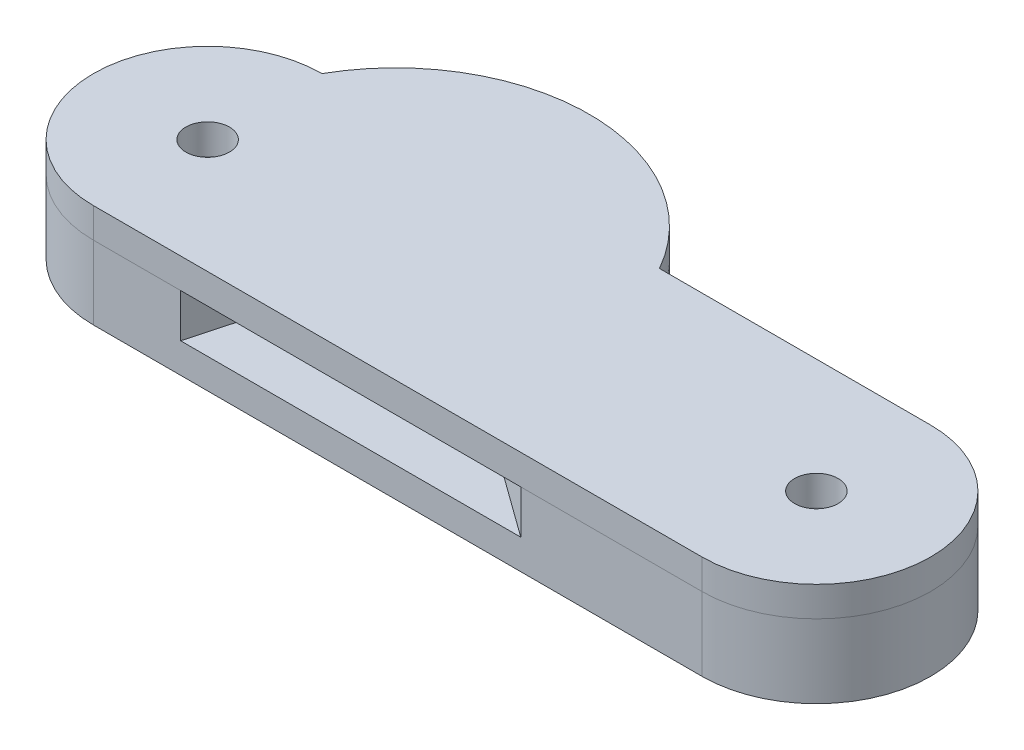
ISO-10303-21;
HEADER;
FILE_DESCRIPTION(('STEP AP214'),'2;1');
FILE_NAME('part.step','',(''),(''),'','','');
FILE_SCHEMA(('AUTOMOTIVE_DESIGN { 1 0 10303 214 1 1 1 1 }'));
ENDSEC;
DATA;
#1=APPLICATION_CONTEXT('core data for automotive mechanical design processes');
#2=APPLICATION_PROTOCOL_DEFINITION('international standard','automotive_design',2000,#1);
#3=PRODUCT_CONTEXT('',#1,'mechanical');
#4=PRODUCT('Part','Part','',(#3));
#5=PRODUCT_RELATED_PRODUCT_CATEGORY('part','',(#4));
#6=PRODUCT_DEFINITION_FORMATION('','',#4);
#7=PRODUCT_DEFINITION_CONTEXT('part definition',#1,'design');
#8=PRODUCT_DEFINITION('design','',#6,#7);
#9=PRODUCT_DEFINITION_SHAPE('','',#8);
#10=(LENGTH_UNIT() NAMED_UNIT(*) SI_UNIT(.MILLI.,.METRE.));
#11=(NAMED_UNIT(*) PLANE_ANGLE_UNIT() SI_UNIT($,.RADIAN.));
#12=(NAMED_UNIT(*) SI_UNIT($,.STERADIAN.) SOLID_ANGLE_UNIT());
#13=UNCERTAINTY_MEASURE_WITH_UNIT(LENGTH_MEASURE(1.E-05),#10,'distance_accuracy_value','');
#14=(GEOMETRIC_REPRESENTATION_CONTEXT(3) GLOBAL_UNCERTAINTY_ASSIGNED_CONTEXT((#13)) GLOBAL_UNIT_ASSIGNED_CONTEXT((#10,
#11,#12)) REPRESENTATION_CONTEXT('',''));
#15=CARTESIAN_POINT('',(0.,0.,0.));
#16=DIRECTION('',(0.,0.,1.));
#17=DIRECTION('',(1.,0.,0.));
#18=AXIS2_PLACEMENT_3D('',#15,#16,#17);
#19=CARTESIAN_POINT('',(0.,2.,0.));
#20=DIRECTION('',(0.,-1.,0.));
#21=DIRECTION('',(0.,0.,-1.));
#22=AXIS2_PLACEMENT_3D('',#19,#20,#21);
#23=PLANE('',#22);
#24=DIRECTION('',(1.,0.,0.));
#25=VECTOR('',#24,1.);
#26=CARTESIAN_POINT('',(0.,2.,10.5003992165423));
#27=LINE('',#26,#25);
#28=CARTESIAN_POINT('',(-55.9305382801715,2.,10.5003992165423));
#29=VERTEX_POINT('',#28);
#30=CARTESIAN_POINT('',(0.,2.,10.5003992165423));
#31=VERTEX_POINT('',#30);
#32=EDGE_CURVE('E98',#29,#31,#27,.T.);
#33=ORIENTED_EDGE('',*,*,#32,.F.);
#34=CARTESIAN_POINT('',(-55.9305382801715,2.,0.));
#35=DIRECTION('',(0.,-1.,0.));
#36=DIRECTION('',(0.,0.,-1.));
#37=AXIS2_PLACEMENT_3D('',#34,#35,#36);
#38=CIRCLE('',#37,10.5003992165423);
#39=CARTESIAN_POINT('',(-55.9305382801715,2.,-10.5003992165423));
#40=VERTEX_POINT('',#39);
#41=EDGE_CURVE('E102',#29,#40,#38,.T.);
#42=ORIENTED_EDGE('',*,*,#41,.T.);
#43=CARTESIAN_POINT('',(-40.4241193156667,2.,-1.7460511013579));
#44=DIRECTION('',(0.,1.,0.));
#45=DIRECTION('',(0.,0.,1.));
#46=AXIS2_PLACEMENT_3D('',#43,#44,#45);
#47=CIRCLE('',#46,17.8069548217708);
#48=CARTESIAN_POINT('',(-24.917700351162,2.,-10.5003992165423));
#49=VERTEX_POINT('',#48);
#50=EDGE_CURVE('E13',#49,#40,#47,.T.);
#51=ORIENTED_EDGE('',*,*,#50,.F.);
#52=DIRECTION('',(1.,0.,0.));
#53=VECTOR('',#52,1.);
#54=CARTESIAN_POINT('',(0.,2.,-10.5003992165423));
#55=LINE('',#54,#53);
#56=CARTESIAN_POINT('',(0.,2.,-10.5003992165423));
#57=VERTEX_POINT('',#56);
#58=EDGE_CURVE('E123',#49,#57,#55,.T.);
#59=ORIENTED_EDGE('',*,*,#58,.T.);
#60=CARTESIAN_POINT('',(0.,2.,0.));
#61=DIRECTION('',(0.,-1.,0.));
#62=DIRECTION('',(0.,0.,-1.));
#63=AXIS2_PLACEMENT_3D('',#60,#61,#62);
#64=CIRCLE('',#63,10.5003992165423);
#65=EDGE_CURVE('E105',#57,#31,#64,.T.);
#66=ORIENTED_EDGE('',*,*,#65,.T.);
#67=EDGE_LOOP('',(#33,#42,#51,#59,#66));
#68=FACE_BOUND('',#67,.T.);
#69=CARTESIAN_POINT('',(0.,2.,0.));
#70=DIRECTION('',(0.,-1.,0.));
#71=DIRECTION('',(0.,0.,-1.));
#72=AXIS2_PLACEMENT_3D('',#69,#70,#71);
#73=CIRCLE('',#72,2.);
#74=CARTESIAN_POINT('',(0.,2.,-2.));
#75=VERTEX_POINT('',#74);
#76=EDGE_CURVE('E150',#75,#75,#73,.T.);
#77=ORIENTED_EDGE('',*,*,#76,.F.);
#78=EDGE_LOOP('',(#77));
#79=FACE_BOUND('',#78,.T.);
#80=CARTESIAN_POINT('',(-55.9305382801715,2.,0.));
#81=DIRECTION('',(0.,-1.,0.));
#82=DIRECTION('',(0.,0.,-1.));
#83=AXIS2_PLACEMENT_3D('',#80,#81,#82);
#84=CIRCLE('',#83,2.);
#85=CARTESIAN_POINT('',(-55.9305382801715,2.,-2.));
#86=VERTEX_POINT('',#85);
#87=EDGE_CURVE('E110',#86,#86,#84,.T.);
#88=ORIENTED_EDGE('',*,*,#87,.F.);
#89=EDGE_LOOP('',(#88));
#90=FACE_BOUND('',#89,.T.);
#91=ADVANCED_FACE('F52',(#68,#79,#90),#23,.T.);
#92=CARTESIAN_POINT('',(0.,4.75,-10.5003992165423));
#93=DIRECTION('',(0.,0.,1.));
#94=DIRECTION('',(1.,0.,0.));
#95=AXIS2_PLACEMENT_3D('',#92,#93,#94);
#96=PLANE('',#95);
#97=ORIENTED_EDGE('',*,*,#58,.F.);
#98=DIRECTION('',(0.,-1.,0.));
#99=VECTOR('',#98,1.);
#100=CARTESIAN_POINT('',(-24.917700351162,37.0570550282,-10.5003992165423));
#101=LINE('',#100,#99);
#102=CARTESIAN_POINT('',(-24.917700351162,4.75,-10.5003992165423));
#103=VERTEX_POINT('',#102);
#104=EDGE_CURVE('E56',#103,#49,#101,.T.);
#105=ORIENTED_EDGE('',*,*,#104,.F.);
#106=DIRECTION('',(-1.,0.,0.));
#107=VECTOR('',#106,1.);
#108=CARTESIAN_POINT('',(0.,4.75,-10.5003992165423));
#109=LINE('',#108,#107);
#110=CARTESIAN_POINT('',(0.,4.75,-10.5003992165423));
#111=VERTEX_POINT('',#110);
#112=EDGE_CURVE('E134',#111,#103,#109,.T.);
#113=ORIENTED_EDGE('',*,*,#112,.F.);
#114=DIRECTION('',(0.,-1.,0.));
#115=VECTOR('',#114,1.);
#116=CARTESIAN_POINT('',(0.,4.75,-10.5003992165423));
#117=LINE('',#116,#115);
#118=EDGE_CURVE('E109',#111,#57,#117,.T.);
#119=ORIENTED_EDGE('',*,*,#118,.T.);
#120=EDGE_LOOP('',(#97,#105,#113,#119));
#121=FACE_BOUND('',#120,.T.);
#122=ADVANCED_FACE('F156',(#121),#96,.F.);
#123=CARTESIAN_POINT('',(0.,4.75,0.));
#124=DIRECTION('',(0.,1.,0.));
#125=DIRECTION('',(0.,0.,1.));
#126=AXIS2_PLACEMENT_3D('',#123,#124,#125);
#127=PLANE('',#126);
#128=CARTESIAN_POINT('',(0.,4.75,0.));
#129=DIRECTION('',(0.,1.,0.));
#130=DIRECTION('',(0.,0.,1.));
#131=AXIS2_PLACEMENT_3D('',#128,#129,#130);
#132=CIRCLE('',#131,2.);
#133=CARTESIAN_POINT('',(0.,4.75,2.));
#134=VERTEX_POINT('',#133);
#135=EDGE_CURVE('E141',#134,#134,#132,.T.);
#136=ORIENTED_EDGE('',*,*,#135,.F.);
#137=EDGE_LOOP('',(#136));
#138=FACE_BOUND('',#137,.T.);
#139=CARTESIAN_POINT('',(0.,4.75,0.));
#140=DIRECTION('',(0.,1.,0.));
#141=DIRECTION('',(0.,0.,1.));
#142=AXIS2_PLACEMENT_3D('',#139,#140,#141);
#143=CIRCLE('',#142,10.5003992165423);
#144=CARTESIAN_POINT('',(0.,4.75,10.5003992165423));
#145=VERTEX_POINT('',#144);
#146=EDGE_CURVE('E139',#145,#111,#143,.T.);
#147=ORIENTED_EDGE('',*,*,#146,.T.);
#148=ORIENTED_EDGE('',*,*,#112,.T.);
#149=CARTESIAN_POINT('',(-40.4241193156667,4.75,-1.7460511013579));
#150=DIRECTION('',(0.,1.,0.));
#151=DIRECTION('',(0.,0.,1.));
#152=AXIS2_PLACEMENT_3D('',#149,#150,#151);
#153=CIRCLE('',#152,17.8069548217708);
#154=CARTESIAN_POINT('',(-55.9305382801715,4.75,-10.5003992165423));
#155=VERTEX_POINT('',#154);
#156=EDGE_CURVE('E68',#103,#155,#153,.T.);
#157=ORIENTED_EDGE('',*,*,#156,.T.);
#158=CARTESIAN_POINT('',(-55.9305382801715,4.75,0.));
#159=DIRECTION('',(0.,1.,0.));
#160=DIRECTION('',(0.,0.,1.));
#161=AXIS2_PLACEMENT_3D('',#158,#159,#160);
#162=CIRCLE('',#161,10.5003992165423);
#163=CARTESIAN_POINT('',(-55.9305382801715,4.75,10.5003992165423));
#164=VERTEX_POINT('',#163);
#165=EDGE_CURVE('E130',#155,#164,#162,.T.);
#166=ORIENTED_EDGE('',*,*,#165,.T.);
#167=DIRECTION('',(1.,0.,0.));
#168=VECTOR('',#167,1.);
#169=CARTESIAN_POINT('',(0.,4.75,10.5003992165423));
#170=LINE('',#169,#168);
#171=EDGE_CURVE('E116',#164,#145,#170,.T.);
#172=ORIENTED_EDGE('',*,*,#171,.T.);
#173=EDGE_LOOP('',(#147,#148,#157,#166,#172));
#174=FACE_BOUND('',#173,.T.);
#175=CARTESIAN_POINT('',(-55.9305382801715,4.75,0.));
#176=DIRECTION('',(0.,1.,0.));
#177=DIRECTION('',(0.,0.,1.));
#178=AXIS2_PLACEMENT_3D('',#175,#176,#177);
#179=CIRCLE('',#178,2.);
#180=CARTESIAN_POINT('',(-55.9305382801715,4.75,2.));
#181=VERTEX_POINT('',#180);
#182=EDGE_CURVE('E144',#181,#181,#179,.T.);
#183=ORIENTED_EDGE('',*,*,#182,.F.);
#184=EDGE_LOOP('',(#183));
#185=FACE_BOUND('',#184,.T.);
#186=ADVANCED_FACE('F157',(#138,#174,#185),#127,.T.);
#187=CARTESIAN_POINT('',(-55.9305382801715,4.75,0.));
#188=DIRECTION('',(0.,-1.,0.));
#189=DIRECTION('',(0.,0.,-1.));
#190=AXIS2_PLACEMENT_3D('',#187,#188,#189);
#191=CYLINDRICAL_SURFACE('',#190,10.5003992165423);
#192=ORIENTED_EDGE('',*,*,#41,.F.);
#193=DIRECTION('',(0.,-1.,0.));
#194=VECTOR('',#193,1.);
#195=CARTESIAN_POINT('',(-55.9305382801715,4.75,10.5003992165423));
#196=LINE('',#195,#194);
#197=EDGE_CURVE('E114',#164,#29,#196,.T.);
#198=ORIENTED_EDGE('',*,*,#197,.F.);
#199=ORIENTED_EDGE('',*,*,#165,.F.);
#200=DIRECTION('',(0.,-1.,0.));
#201=VECTOR('',#200,1.);
#202=CARTESIAN_POINT('',(-55.9305382801715,4.75,-10.5003992165423));
#203=LINE('',#202,#201);
#204=EDGE_CURVE('E72',#155,#40,#203,.T.);
#205=ORIENTED_EDGE('',*,*,#204,.T.);
#206=EDGE_LOOP('',(#192,#198,#199,#205));
#207=FACE_BOUND('',#206,.T.);
#208=ADVANCED_FACE('F121',(#207),#191,.T.);
#209=CARTESIAN_POINT('',(-40.4241193156667,37.0570550282,-1.7460511013579));
#210=DIRECTION('',(0.,-1.,0.));
#211=DIRECTION('',(0.,0.,-1.));
#212=AXIS2_PLACEMENT_3D('',#209,#210,#211);
#213=CYLINDRICAL_SURFACE('',#212,17.8069548217708);
#214=ORIENTED_EDGE('',*,*,#104,.T.);
#215=ORIENTED_EDGE('',*,*,#50,.T.);
#216=ORIENTED_EDGE('',*,*,#204,.F.);
#217=ORIENTED_EDGE('',*,*,#156,.F.);
#218=EDGE_LOOP('',(#214,#215,#216,#217));
#219=FACE_BOUND('',#218,.T.);
#220=ADVANCED_FACE('F184',(#219),#213,.T.);
#221=CARTESIAN_POINT('',(0.,4.75,0.));
#222=DIRECTION('',(0.,-1.,0.));
#223=DIRECTION('',(0.,0.,-1.));
#224=AXIS2_PLACEMENT_3D('',#221,#222,#223);
#225=CYLINDRICAL_SURFACE('',#224,10.5003992165423);
#226=ORIENTED_EDGE('',*,*,#65,.F.);
#227=ORIENTED_EDGE('',*,*,#118,.F.);
#228=ORIENTED_EDGE('',*,*,#146,.F.);
#229=DIRECTION('',(0.,-1.,0.));
#230=VECTOR('',#229,1.);
#231=CARTESIAN_POINT('',(0.,4.75,10.5003992165423));
#232=LINE('',#231,#230);
#233=EDGE_CURVE('E119',#145,#31,#232,.T.);
#234=ORIENTED_EDGE('',*,*,#233,.T.);
#235=EDGE_LOOP('',(#226,#227,#228,#234));
#236=FACE_BOUND('',#235,.T.);
#237=ADVANCED_FACE('F155',(#236),#225,.T.);
#238=CARTESIAN_POINT('',(0.,4.75,10.5003992165423));
#239=DIRECTION('',(0.,0.,-1.));
#240=DIRECTION('',(-1.,0.,0.));
#241=AXIS2_PLACEMENT_3D('',#238,#239,#240);
#242=PLANE('',#241);
#243=ORIENTED_EDGE('',*,*,#32,.T.);
#244=ORIENTED_EDGE('',*,*,#233,.F.);
#245=ORIENTED_EDGE('',*,*,#171,.F.);
#246=ORIENTED_EDGE('',*,*,#197,.T.);
#247=EDGE_LOOP('',(#243,#244,#245,#246));
#248=FACE_BOUND('',#247,.T.);
#249=ADVANCED_FACE('F115',(#248),#242,.F.);
#250=CARTESIAN_POINT('',(-55.9305382801715,4.75,0.));
#251=DIRECTION('',(0.,-1.,0.));
#252=DIRECTION('',(0.,0.,-1.));
#253=AXIS2_PLACEMENT_3D('',#250,#251,#252);
#254=CYLINDRICAL_SURFACE('',#253,2.);
#255=ORIENTED_EDGE('',*,*,#182,.T.);
#256=EDGE_LOOP('',(#255));
#257=FACE_BOUND('',#256,.T.);
#258=ORIENTED_EDGE('',*,*,#87,.T.);
#259=EDGE_LOOP('',(#258));
#260=FACE_BOUND('',#259,.T.);
#261=ADVANCED_FACE('F54',(#257,#260),#254,.F.);
#262=CARTESIAN_POINT('',(0.,4.75,0.));
#263=DIRECTION('',(0.,-1.,0.));
#264=DIRECTION('',(0.,0.,-1.));
#265=AXIS2_PLACEMENT_3D('',#262,#263,#264);
#266=CYLINDRICAL_SURFACE('',#265,2.);
#267=ORIENTED_EDGE('',*,*,#135,.T.);
#268=EDGE_LOOP('',(#267));
#269=FACE_BOUND('',#268,.T.);
#270=ORIENTED_EDGE('',*,*,#76,.T.);
#271=EDGE_LOOP('',(#270));
#272=FACE_BOUND('',#271,.T.);
#273=ADVANCED_FACE('F166',(#269,#272),#266,.F.);
#274=CLOSED_SHELL('',(#91,#122,#186,#208,#220,#237,#249,#261,#273));
#275=MANIFOLD_SOLID_BREP('B2',#274);
#276=CARTESIAN_POINT('',(0.,2.,0.));
#277=DIRECTION('',(0.,-1.,0.));
#278=DIRECTION('',(0.,0.,-1.));
#279=AXIS2_PLACEMENT_3D('',#276,#277,#278);
#280=PLANE('',#279);
#281=CARTESIAN_POINT('',(0.,2.,0.));
#282=DIRECTION('',(0.,-1.,0.));
#283=DIRECTION('',(0.,0.,-1.));
#284=AXIS2_PLACEMENT_3D('',#281,#282,#283);
#285=CIRCLE('',#284,2.);
#286=CARTESIAN_POINT('',(0.,2.,-2.));
#287=VERTEX_POINT('',#286);
#288=EDGE_CURVE('E266',#287,#287,#285,.T.);
#289=ORIENTED_EDGE('',*,*,#288,.T.);
#290=EDGE_LOOP('',(#289));
#291=FACE_BOUND('',#290,.T.);
#292=CARTESIAN_POINT('',(0.,2.,0.));
#293=DIRECTION('',(0.,-1.,0.));
#294=DIRECTION('',(0.,0.,-1.));
#295=AXIS2_PLACEMENT_3D('',#292,#293,#294);
#296=CIRCLE('',#295,10.5003992165423);
#297=CARTESIAN_POINT('',(0.,2.,-10.5003992165423));
#298=VERTEX_POINT('',#297);
#299=CARTESIAN_POINT('',(0.,2.,10.5003992165423));
#300=VERTEX_POINT('',#299);
#301=EDGE_CURVE('E458',#298,#300,#296,.T.);
#302=ORIENTED_EDGE('',*,*,#301,.F.);
#303=DIRECTION('',(1.,0.,0.));
#304=VECTOR('',#303,1.);
#305=CARTESIAN_POINT('',(0.,2.,-10.5003992165423));
#306=LINE('',#305,#304);
#307=CARTESIAN_POINT('',(-24.917700351162,2.,-10.5003992165423));
#308=VERTEX_POINT('',#307);
#309=EDGE_CURVE('E455',#308,#298,#306,.T.);
#310=ORIENTED_EDGE('',*,*,#309,.F.);
#311=CARTESIAN_POINT('',(-40.4241193156667,2.,-1.7460511013579));
#312=DIRECTION('',(0.,-1.,0.));
#313=DIRECTION('',(0.,0.,-1.));
#314=AXIS2_PLACEMENT_3D('',#311,#312,#313);
#315=CIRCLE('',#314,17.8069548217708);
#316=CARTESIAN_POINT('',(-35.7381547906292,2.,-18.9253810211969));
#317=VERTEX_POINT('',#316);
#318=EDGE_CURVE('E274',#317,#308,#315,.T.);
#319=ORIENTED_EDGE('',*,*,#318,.F.);
#320=DIRECTION('',(0.263153614525288,0.,-0.964753945398658));
#321=VECTOR('',#320,1.);
#322=CARTESIAN_POINT('',(-35.7518279113757,2.,-18.8752536565782));
#323=LINE('',#322,#321);
#324=CARTESIAN_POINT('',(-39.2995259463282,2.,-5.86895054165502));
#325=VERTEX_POINT('',#324);
#326=EDGE_CURVE('E361',#325,#317,#323,.T.);
#327=ORIENTED_EDGE('',*,*,#326,.F.);
#328=DIRECTION('',(-0.810372315489383,0.,-0.585915275691269));
#329=VECTOR('',#328,1.);
#330=CARTESIAN_POINT('',(26.6452391554762,2.,41.8104240945407));
#331=LINE('',#330,#329);
#332=CARTESIAN_POINT('',(-16.659276720951,2.,10.5003992165423));
#333=VERTEX_POINT('',#332);
#334=EDGE_CURVE('E379',#333,#325,#331,.T.);
#335=ORIENTED_EDGE('',*,*,#334,.F.);
#336=DIRECTION('',(-1.,0.,0.));
#337=VECTOR('',#336,1.);
#338=CARTESIAN_POINT('',(0.,2.,10.5003992165423));
#339=LINE('',#338,#337);
#340=EDGE_CURVE('E282',#300,#333,#339,.T.);
#341=ORIENTED_EDGE('',*,*,#340,.F.);
#342=EDGE_LOOP('',(#302,#310,#319,#327,#335,#341));
#343=FACE_BOUND('',#342,.T.);
#344=ADVANCED_FACE('F256',(#291,#343),#280,.F.);
#345=CARTESIAN_POINT('',(-55.9305382801715,2.,0.));
#346=DIRECTION('',(0.,-1.,0.));
#347=DIRECTION('',(0.,0.,-1.));
#348=AXIS2_PLACEMENT_3D('',#345,#346,#347);
#349=CIRCLE('',#348,2.);
#350=CARTESIAN_POINT('',(-55.9305382801715,2.,-2.));
#351=VERTEX_POINT('',#350);
#352=EDGE_CURVE('E50',#351,#351,#349,.T.);
#353=ORIENTED_EDGE('',*,*,#352,.T.);
#354=EDGE_LOOP('',(#353));
#355=FACE_BOUND('',#354,.T.);
#356=CARTESIAN_POINT('',(-55.9305382801715,2.,0.));
#357=DIRECTION('',(0.,-1.,0.));
#358=DIRECTION('',(0.,0.,-1.));
#359=AXIS2_PLACEMENT_3D('',#356,#357,#358);
#360=CIRCLE('',#359,10.5003992165423);
#361=CARTESIAN_POINT('',(-55.9305382801715,2.,10.5003992165423));
#362=VERTEX_POINT('',#361);
#363=CARTESIAN_POINT('',(-55.9305382801715,2.,-10.5003992165423));
#364=VERTEX_POINT('',#363);
#365=EDGE_CURVE('E260',#362,#364,#360,.T.);
#366=ORIENTED_EDGE('',*,*,#365,.F.);
#367=CARTESIAN_POINT('',(-47.9106890267398,2.,10.5003992165423));
#368=VERTEX_POINT('',#367);
#369=EDGE_CURVE('E461',#368,#362,#339,.T.);
#370=ORIENTED_EDGE('',*,*,#369,.F.);
#371=DIRECTION('',(-0.263153614525289,0.,0.964753945398657));
#372=VECTOR('',#371,1.);
#373=CARTESIAN_POINT('',(-43.8872651072943,2.,-4.24997427651618));
#374=LINE('',#373,#372);
#375=CARTESIAN_POINT('',(-43.8872651072943,2.,-4.24997427651618));
#376=VERTEX_POINT('',#375);
#377=EDGE_CURVE('E381',#376,#368,#374,.T.);
#378=ORIENTED_EDGE('',*,*,#377,.F.);
#379=DIRECTION('',(0.810372315489383,0.,0.585915275691269));
#380=VECTOR('',#379,1.);
#381=CARTESIAN_POINT('',(-43.8872651072943,2.,-4.24997427651618));
#382=LINE('',#381,#380);
#383=CARTESIAN_POINT('',(-54.8543825263999,2.,-12.1794179449777));
#384=VERTEX_POINT('',#383);
#385=EDGE_CURVE('E394',#384,#376,#382,.T.);
#386=ORIENTED_EDGE('',*,*,#385,.F.);
#387=EDGE_CURVE('E454',#364,#384,#315,.T.);
#388=ORIENTED_EDGE('',*,*,#387,.F.);
#389=EDGE_LOOP('',(#366,#370,#378,#386,#388));
#390=FACE_BOUND('',#389,.T.);
#391=ADVANCED_FACE('F258',(#355,#390),#280,.F.);
#392=CARTESIAN_POINT('',(-40.4241193156667,37.0570550282,-1.7460511013579));
#393=DIRECTION('',(0.,-1.,0.));
#394=DIRECTION('',(0.,0.,-1.));
#395=AXIS2_PLACEMENT_3D('',#392,#393,#394);
#396=CYLINDRICAL_SURFACE('',#395,17.8069548217708);
#397=DIRECTION('',(0.,1.,0.));
#398=VECTOR('',#397,1.);
#399=CARTESIAN_POINT('',(-35.7381547906292,-2.,-18.9253810211969));
#400=LINE('',#399,#398);
#401=CARTESIAN_POINT('',(-35.7381547906292,-2.,-18.9253810211969));
#402=VERTEX_POINT('',#401);
#403=EDGE_CURVE('E358',#402,#317,#400,.T.);
#404=ORIENTED_EDGE('',*,*,#403,.T.);
#405=ORIENTED_EDGE('',*,*,#318,.T.);
#406=DIRECTION('',(0.,-1.,0.));
#407=VECTOR('',#406,1.);
#408=CARTESIAN_POINT('',(-24.917700351162,37.0570550282,-10.5003992165423));
#409=LINE('',#408,#407);
#410=CARTESIAN_POINT('',(-24.917700351162,-4.75,-10.5003992165423));
#411=VERTEX_POINT('',#410);
#412=EDGE_CURVE('E376',#308,#411,#409,.T.);
#413=ORIENTED_EDGE('',*,*,#412,.T.);
#414=CARTESIAN_POINT('',(-40.4241193156667,-4.75,-1.7460511013579));
#415=DIRECTION('',(0.,1.,0.));
#416=DIRECTION('',(0.,0.,1.));
#417=AXIS2_PLACEMENT_3D('',#414,#415,#416);
#418=CIRCLE('',#417,17.8069548217708);
#419=CARTESIAN_POINT('',(-55.9305382801715,-4.75,-10.5003992165423));
#420=VERTEX_POINT('',#419);
#421=EDGE_CURVE('E371',#420,#411,#418,.F.);
#422=ORIENTED_EDGE('',*,*,#421,.F.);
#423=DIRECTION('',(0.,-1.,0.));
#424=VECTOR('',#423,1.);
#425=CARTESIAN_POINT('',(-55.9305382801715,4.75,-10.5003992165423));
#426=LINE('',#425,#424);
#427=EDGE_CURVE('E435',#364,#420,#426,.T.);
#428=ORIENTED_EDGE('',*,*,#427,.F.);
#429=ORIENTED_EDGE('',*,*,#387,.T.);
#430=DIRECTION('',(0.,1.,0.));
#431=VECTOR('',#430,1.);
#432=CARTESIAN_POINT('',(-54.8543825263999,-2.,-12.1794179449777));
#433=LINE('',#432,#431);
#434=CARTESIAN_POINT('',(-54.8543825263999,-2.,-12.1794179449777));
#435=VERTEX_POINT('',#434);
#436=EDGE_CURVE('E363',#435,#384,#433,.T.);
#437=ORIENTED_EDGE('',*,*,#436,.F.);
#438=CARTESIAN_POINT('',(-40.4241193156667,-2.,-1.7460511013579));
#439=DIRECTION('',(0.,1.,0.));
#440=DIRECTION('',(0.,0.,1.));
#441=AXIS2_PLACEMENT_3D('',#438,#439,#440);
#442=CIRCLE('',#441,17.8069548217708);
#443=EDGE_CURVE('E348',#402,#435,#442,.T.);
#444=ORIENTED_EDGE('',*,*,#443,.F.);
#445=EDGE_LOOP('',(#404,#405,#413,#422,#428,#429,#437,#444));
#446=FACE_BOUND('',#445,.T.);
#447=ADVANCED_FACE('F365',(#446),#396,.T.);
#448=CARTESIAN_POINT('',(0.,4.75,-10.5003992165423));
#449=DIRECTION('',(0.,0.,1.));
#450=DIRECTION('',(1.,0.,0.));
#451=AXIS2_PLACEMENT_3D('',#448,#449,#450);
#452=PLANE('',#451);
#453=ORIENTED_EDGE('',*,*,#412,.F.);
#454=ORIENTED_EDGE('',*,*,#309,.T.);
#455=DIRECTION('',(0.,-1.,0.));
#456=VECTOR('',#455,1.);
#457=CARTESIAN_POINT('',(0.,4.75,-10.5003992165423));
#458=LINE('',#457,#456);
#459=CARTESIAN_POINT('',(0.,-4.75,-10.5003992165423));
#460=VERTEX_POINT('',#459);
#461=EDGE_CURVE('E438',#298,#460,#458,.T.);
#462=ORIENTED_EDGE('',*,*,#461,.T.);
#463=DIRECTION('',(-1.,0.,0.));
#464=VECTOR('',#463,1.);
#465=CARTESIAN_POINT('',(0.,-4.75,-10.5003992165423));
#466=LINE('',#465,#464);
#467=EDGE_CURVE('E417',#460,#411,#466,.T.);
#468=ORIENTED_EDGE('',*,*,#467,.T.);
#469=EDGE_LOOP('',(#453,#454,#462,#468));
#470=FACE_BOUND('',#469,.T.);
#471=ADVANCED_FACE('F504',(#470),#452,.F.);
#472=CARTESIAN_POINT('',(0.,4.75,10.5003992165423));
#473=DIRECTION('',(0.,0.,-1.));
#474=DIRECTION('',(-1.,0.,0.));
#475=AXIS2_PLACEMENT_3D('',#472,#473,#474);
#476=PLANE('',#475);
#477=DIRECTION('',(0.,-1.,0.));
#478=VECTOR('',#477,1.);
#479=CARTESIAN_POINT('',(0.,4.75,10.5003992165423));
#480=LINE('',#479,#478);
#481=CARTESIAN_POINT('',(0.,-4.75,10.5003992165423));
#482=VERTEX_POINT('',#481);
#483=EDGE_CURVE('E429',#300,#482,#480,.T.);
#484=ORIENTED_EDGE('',*,*,#483,.F.);
#485=ORIENTED_EDGE('',*,*,#340,.T.);
#486=DIRECTION('',(0.,-1.,0.));
#487=VECTOR('',#486,1.);
#488=CARTESIAN_POINT('',(-16.659276720951,4.75,10.5003992165423));
#489=LINE('',#488,#487);
#490=CARTESIAN_POINT('',(-16.659276720951,-2.,10.5003992165423));
#491=VERTEX_POINT('',#490);
#492=EDGE_CURVE('E445',#333,#491,#489,.T.);
#493=ORIENTED_EDGE('',*,*,#492,.T.);
#494=DIRECTION('',(1.,0.,0.));
#495=VECTOR('',#494,1.);
#496=CARTESIAN_POINT('',(0.,-2.,10.5003992165423));
#497=LINE('',#496,#495);
#498=CARTESIAN_POINT('',(-47.9106890267398,-2.,10.5003992165423));
#499=VERTEX_POINT('',#498);
#500=EDGE_CURVE('E449',#499,#491,#497,.T.);
#501=ORIENTED_EDGE('',*,*,#500,.F.);
#502=DIRECTION('',(0.,1.,0.));
#503=VECTOR('',#502,1.);
#504=CARTESIAN_POINT('',(-47.9106890267398,4.75,10.5003992165423));
#505=LINE('',#504,#503);
#506=EDGE_CURVE('E441',#499,#368,#505,.T.);
#507=ORIENTED_EDGE('',*,*,#506,.T.);
#508=ORIENTED_EDGE('',*,*,#369,.T.);
#509=DIRECTION('',(0.,-1.,0.));
#510=VECTOR('',#509,1.);
#511=CARTESIAN_POINT('',(-55.9305382801715,4.75,10.5003992165423));
#512=LINE('',#511,#510);
#513=CARTESIAN_POINT('',(-55.9305382801715,-4.75,10.5003992165423));
#514=VERTEX_POINT('',#513);
#515=EDGE_CURVE('E432',#362,#514,#512,.T.);
#516=ORIENTED_EDGE('',*,*,#515,.T.);
#517=DIRECTION('',(1.,0.,0.));
#518=VECTOR('',#517,1.);
#519=CARTESIAN_POINT('',(0.,-4.75,10.5003992165423));
#520=LINE('',#519,#518);
#521=EDGE_CURVE('E425',#514,#482,#520,.T.);
#522=ORIENTED_EDGE('',*,*,#521,.T.);
#523=EDGE_LOOP('',(#484,#485,#493,#501,#507,#508,#516,#522));
#524=FACE_BOUND('',#523,.T.);
#525=ADVANCED_FACE('F480',(#524),#476,.F.);
#526=CARTESIAN_POINT('',(0.,-4.75,0.));
#527=DIRECTION('',(0.,1.,0.));
#528=DIRECTION('',(0.,0.,1.));
#529=AXIS2_PLACEMENT_3D('',#526,#527,#528);
#530=PLANE('',#529);
#531=CARTESIAN_POINT('',(0.,-4.75,0.));
#532=DIRECTION('',(0.,1.,0.));
#533=DIRECTION('',(0.,0.,1.));
#534=AXIS2_PLACEMENT_3D('',#531,#532,#533);
#535=CIRCLE('',#534,10.5003992165423);
#536=EDGE_CURVE('E413',#482,#460,#535,.T.);
#537=ORIENTED_EDGE('',*,*,#536,.F.);
#538=ORIENTED_EDGE('',*,*,#521,.F.);
#539=CARTESIAN_POINT('',(-55.9305382801715,-4.75,0.));
#540=DIRECTION('',(0.,1.,0.));
#541=DIRECTION('',(0.,0.,1.));
#542=AXIS2_PLACEMENT_3D('',#539,#540,#541);
#543=CIRCLE('',#542,10.5003992165423);
#544=EDGE_CURVE('E421',#420,#514,#543,.T.);
#545=ORIENTED_EDGE('',*,*,#544,.F.);
#546=ORIENTED_EDGE('',*,*,#421,.T.);
#547=ORIENTED_EDGE('',*,*,#467,.F.);
#548=EDGE_LOOP('',(#537,#538,#545,#546,#547));
#549=FACE_BOUND('',#548,.T.);
#550=CARTESIAN_POINT('',(0.,-4.75,0.));
#551=DIRECTION('',(0.,1.,0.));
#552=DIRECTION('',(0.,0.,1.));
#553=AXIS2_PLACEMENT_3D('',#550,#551,#552);
#554=CIRCLE('',#553,2.);
#555=CARTESIAN_POINT('',(0.,-4.75,2.));
#556=VERTEX_POINT('',#555);
#557=EDGE_CURVE('E409',#556,#556,#554,.T.);
#558=ORIENTED_EDGE('',*,*,#557,.T.);
#559=EDGE_LOOP('',(#558));
#560=FACE_BOUND('',#559,.T.);
#561=CARTESIAN_POINT('',(-55.9305382801715,-4.75,0.));
#562=DIRECTION('',(0.,1.,0.));
#563=DIRECTION('',(0.,0.,1.));
#564=AXIS2_PLACEMENT_3D('',#561,#562,#563);
#565=CIRCLE('',#564,2.);
#566=CARTESIAN_POINT('',(-55.9305382801715,-4.75,2.));
#567=VERTEX_POINT('',#566);
#568=EDGE_CURVE('E403',#567,#567,#565,.T.);
#569=ORIENTED_EDGE('',*,*,#568,.T.);
#570=EDGE_LOOP('',(#569));
#571=FACE_BOUND('',#570,.T.);
#572=ADVANCED_FACE('F476',(#549,#560,#571),#530,.F.);
#573=CARTESIAN_POINT('',(0.,4.75,0.));
#574=DIRECTION('',(0.,-1.,0.));
#575=DIRECTION('',(0.,0.,-1.));
#576=AXIS2_PLACEMENT_3D('',#573,#574,#575);
#577=CYLINDRICAL_SURFACE('',#576,10.5003992165423);
#578=ORIENTED_EDGE('',*,*,#461,.F.);
#579=ORIENTED_EDGE('',*,*,#301,.T.);
#580=ORIENTED_EDGE('',*,*,#483,.T.);
#581=ORIENTED_EDGE('',*,*,#536,.T.);
#582=EDGE_LOOP('',(#578,#579,#580,#581));
#583=FACE_BOUND('',#582,.T.);
#584=ADVANCED_FACE('F479',(#583),#577,.T.);
#585=CARTESIAN_POINT('',(-55.9305382801715,4.75,0.));
#586=DIRECTION('',(0.,-1.,0.));
#587=DIRECTION('',(0.,0.,-1.));
#588=AXIS2_PLACEMENT_3D('',#585,#586,#587);
#589=CYLINDRICAL_SURFACE('',#588,10.5003992165423);
#590=ORIENTED_EDGE('',*,*,#515,.F.);
#591=ORIENTED_EDGE('',*,*,#365,.T.);
#592=ORIENTED_EDGE('',*,*,#427,.T.);
#593=ORIENTED_EDGE('',*,*,#544,.T.);
#594=EDGE_LOOP('',(#590,#591,#592,#593));
#595=FACE_BOUND('',#594,.T.);
#596=ADVANCED_FACE('F472',(#595),#589,.T.);
#597=CARTESIAN_POINT('',(0.,4.75,0.));
#598=DIRECTION('',(0.,-1.,0.));
#599=DIRECTION('',(0.,0.,-1.));
#600=AXIS2_PLACEMENT_3D('',#597,#598,#599);
#601=CYLINDRICAL_SURFACE('',#600,2.);
#602=ORIENTED_EDGE('',*,*,#288,.F.);
#603=EDGE_LOOP('',(#602));
#604=FACE_BOUND('',#603,.T.);
#605=ORIENTED_EDGE('',*,*,#557,.F.);
#606=EDGE_LOOP('',(#605));
#607=FACE_BOUND('',#606,.T.);
#608=ADVANCED_FACE('F468',(#604,#607),#601,.F.);
#609=CARTESIAN_POINT('',(-55.9305382801715,4.75,0.));
#610=DIRECTION('',(0.,-1.,0.));
#611=DIRECTION('',(0.,0.,-1.));
#612=AXIS2_PLACEMENT_3D('',#609,#610,#611);
#613=CYLINDRICAL_SURFACE('',#612,2.);
#614=ORIENTED_EDGE('',*,*,#352,.F.);
#615=EDGE_LOOP('',(#614));
#616=FACE_BOUND('',#615,.T.);
#617=ORIENTED_EDGE('',*,*,#568,.F.);
#618=EDGE_LOOP('',(#617));
#619=FACE_BOUND('',#618,.T.);
#620=ADVANCED_FACE('F471',(#616,#619),#613,.F.);
#621=CARTESIAN_POINT('',(-43.8872651072943,-2.,-4.24997427651618));
#622=DIRECTION('',(-0.585915275691269,0.,0.810372315489383));
#623=DIRECTION('',(0.810372315489383,0.,0.585915275691269));
#624=AXIS2_PLACEMENT_3D('',#621,#622,#623);
#625=PLANE('',#624);
#626=ORIENTED_EDGE('',*,*,#385,.T.);
#627=DIRECTION('',(0.,1.,0.));
#628=VECTOR('',#627,1.);
#629=CARTESIAN_POINT('',(-43.8872651072943,-2.,-4.24997427651618));
#630=LINE('',#629,#628);
#631=CARTESIAN_POINT('',(-43.8872651072943,-2.,-4.24997427651618));
#632=VERTEX_POINT('',#631);
#633=EDGE_CURVE('E399',#632,#376,#630,.T.);
#634=ORIENTED_EDGE('',*,*,#633,.F.);
#635=DIRECTION('',(0.810372315489383,0.,0.585915275691269));
#636=VECTOR('',#635,1.);
#637=CARTESIAN_POINT('',(-43.8872651072943,-2.,-4.24997427651618));
#638=LINE('',#637,#636);
#639=EDGE_CURVE('E356',#435,#632,#638,.T.);
#640=ORIENTED_EDGE('',*,*,#639,.F.);
#641=ORIENTED_EDGE('',*,*,#436,.T.);
#642=EDGE_LOOP('',(#626,#634,#640,#641));
#643=FACE_BOUND('',#642,.T.);
#644=ADVANCED_FACE('F486',(#643),#625,.F.);
#645=CARTESIAN_POINT('',(-35.7518279113757,-2.,-18.8752536565782));
#646=DIRECTION('',(0.964753945398658,0.,0.263153614525288));
#647=DIRECTION('',(0.263153614525288,0.,-0.964753945398658));
#648=AXIS2_PLACEMENT_3D('',#645,#646,#647);
#649=PLANE('',#648);
#650=DIRECTION('',(0.263153614525288,0.,-0.964753945398658));
#651=VECTOR('',#650,1.);
#652=CARTESIAN_POINT('',(-35.7518279113757,-2.,-18.8752536565782));
#653=LINE('',#652,#651);
#654=CARTESIAN_POINT('',(-39.2995259463282,-2.,-5.86895054165502));
#655=VERTEX_POINT('',#654);
#656=EDGE_CURVE('E344',#655,#402,#653,.T.);
#657=ORIENTED_EDGE('',*,*,#656,.F.);
#658=DIRECTION('',(0.,1.,0.));
#659=VECTOR('',#658,1.);
#660=CARTESIAN_POINT('',(-39.2995259463282,-2.,-5.86895054165502));
#661=LINE('',#660,#659);
#662=EDGE_CURVE('E389',#655,#325,#661,.T.);
#663=ORIENTED_EDGE('',*,*,#662,.T.);
#664=ORIENTED_EDGE('',*,*,#326,.T.);
#665=ORIENTED_EDGE('',*,*,#403,.F.);
#666=EDGE_LOOP('',(#657,#663,#664,#665));
#667=FACE_BOUND('',#666,.T.);
#668=ADVANCED_FACE('F359',(#667),#649,.F.);
#669=CARTESIAN_POINT('',(26.6452391554762,-2.,41.8104240945407));
#670=DIRECTION('',(0.585915275691269,0.,-0.810372315489383));
#671=DIRECTION('',(-0.810372315489383,0.,-0.585915275691269));
#672=AXIS2_PLACEMENT_3D('',#669,#670,#671);
#673=PLANE('',#672);
#674=ORIENTED_EDGE('',*,*,#334,.T.);
#675=ORIENTED_EDGE('',*,*,#662,.F.);
#676=DIRECTION('',(-0.810372315489383,0.,-0.585915275691269));
#677=VECTOR('',#676,1.);
#678=CARTESIAN_POINT('',(26.6452391554762,-2.,41.8104240945407));
#679=LINE('',#678,#677);
#680=EDGE_CURVE('E351',#491,#655,#679,.T.);
#681=ORIENTED_EDGE('',*,*,#680,.F.);
#682=ORIENTED_EDGE('',*,*,#492,.F.);
#683=EDGE_LOOP('',(#674,#675,#681,#682));
#684=FACE_BOUND('',#683,.T.);
#685=ADVANCED_FACE('F513',(#684),#673,.F.);
#686=CARTESIAN_POINT('',(-43.8872651072943,-2.,-4.24997427651618));
#687=DIRECTION('',(-0.964753945398657,0.,-0.263153614525289));
#688=DIRECTION('',(-0.263153614525289,0.,0.964753945398657));
#689=AXIS2_PLACEMENT_3D('',#686,#687,#688);
#690=PLANE('',#689);
#691=DIRECTION('',(-0.263153614525289,0.,0.964753945398657));
#692=VECTOR('',#691,1.);
#693=CARTESIAN_POINT('',(-43.8872651072943,-2.,-4.24997427651618));
#694=LINE('',#693,#692);
#695=EDGE_CURVE('E385',#632,#499,#694,.T.);
#696=ORIENTED_EDGE('',*,*,#695,.F.);
#697=ORIENTED_EDGE('',*,*,#633,.T.);
#698=ORIENTED_EDGE('',*,*,#377,.T.);
#699=ORIENTED_EDGE('',*,*,#506,.F.);
#700=EDGE_LOOP('',(#696,#697,#698,#699));
#701=FACE_BOUND('',#700,.T.);
#702=ADVANCED_FACE('F508',(#701),#690,.F.);
#703=CARTESIAN_POINT('',(-41.5933955268113,-2.,-5.05946240908561));
#704=DIRECTION('',(0.,1.,0.));
#705=DIRECTION('',(0.,0.,1.));
#706=AXIS2_PLACEMENT_3D('',#703,#704,#705);
#707=PLANE('',#706);
#708=ORIENTED_EDGE('',*,*,#656,.T.);
#709=ORIENTED_EDGE('',*,*,#443,.T.);
#710=ORIENTED_EDGE('',*,*,#639,.T.);
#711=ORIENTED_EDGE('',*,*,#695,.T.);
#712=ORIENTED_EDGE('',*,*,#500,.T.);
#713=ORIENTED_EDGE('',*,*,#680,.T.);
#714=EDGE_LOOP('',(#708,#709,#710,#711,#712,#713));
#715=FACE_BOUND('',#714,.T.);
#716=ADVANCED_FACE('F346',(#715),#707,.T.);
#717=CLOSED_SHELL('',(#344,#391,#447,#471,#525,#572,#584,#596,#608,#620,#644,#668,#685,#702,#716));
#718=MANIFOLD_SOLID_BREP('B7',#717);
#719=ADVANCED_BREP_SHAPE_REPRESENTATION('',(#18,#275,#718),#14);
#720=SHAPE_DEFINITION_REPRESENTATION(#9,#719);
ENDSEC;
END-ISO-10303-21;
